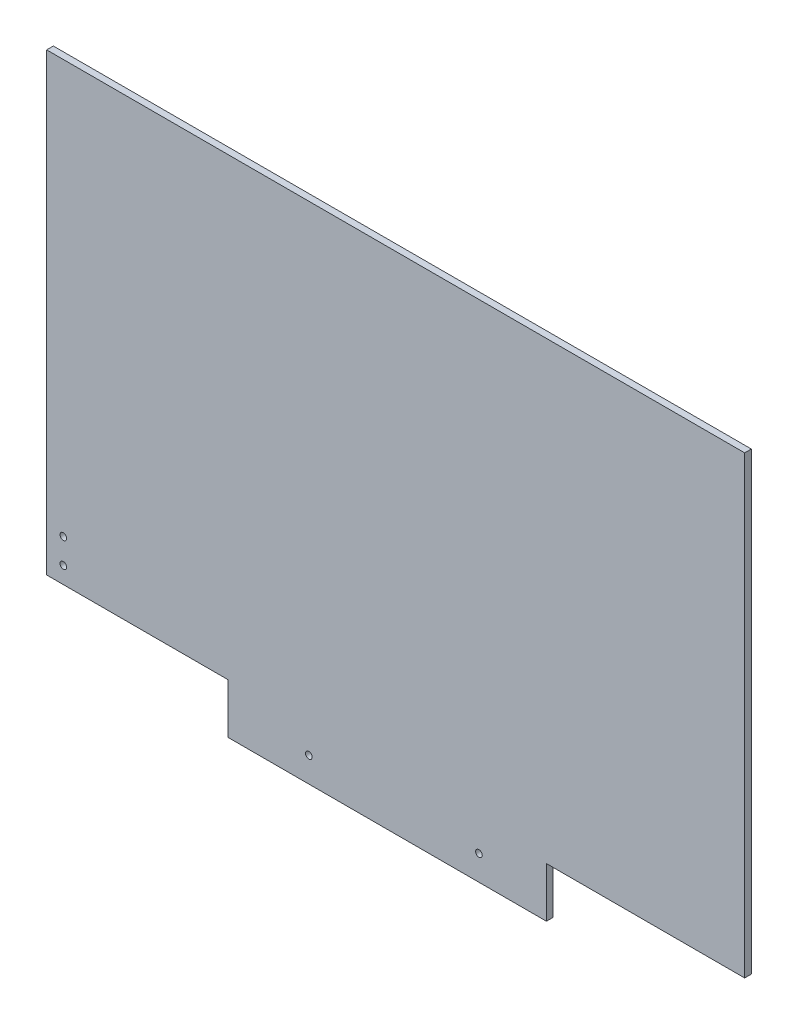
ISO-10303-21;
HEADER;
FILE_DESCRIPTION(('STEP AP214'),'2;1');
FILE_NAME('part.step','',(''),(''),'','','');
FILE_SCHEMA(('AUTOMOTIVE_DESIGN { 1 0 10303 214 1 1 1 1 }'));
ENDSEC;
DATA;
#1=APPLICATION_CONTEXT('core data for automotive mechanical design processes');
#2=APPLICATION_PROTOCOL_DEFINITION('international standard','automotive_design',2000,#1);
#3=PRODUCT_CONTEXT('',#1,'mechanical');
#4=PRODUCT('Part','Part','',(#3));
#5=PRODUCT_RELATED_PRODUCT_CATEGORY('part','',(#4));
#6=PRODUCT_DEFINITION_FORMATION('','',#4);
#7=PRODUCT_DEFINITION_CONTEXT('part definition',#1,'design');
#8=PRODUCT_DEFINITION('design','',#6,#7);
#9=PRODUCT_DEFINITION_SHAPE('','',#8);
#10=(LENGTH_UNIT() NAMED_UNIT(*) SI_UNIT(.MILLI.,.METRE.));
#11=(NAMED_UNIT(*) PLANE_ANGLE_UNIT() SI_UNIT($,.RADIAN.));
#12=(NAMED_UNIT(*) SI_UNIT($,.STERADIAN.) SOLID_ANGLE_UNIT());
#13=UNCERTAINTY_MEASURE_WITH_UNIT(LENGTH_MEASURE(1.E-05),#10,'distance_accuracy_value','');
#14=(GEOMETRIC_REPRESENTATION_CONTEXT(3) GLOBAL_UNCERTAINTY_ASSIGNED_CONTEXT((#13)) GLOBAL_UNIT_ASSIGNED_CONTEXT((#10,
#11,#12)) REPRESENTATION_CONTEXT('',''));
#15=CARTESIAN_POINT('',(0.,0.,0.));
#16=DIRECTION('',(0.,0.,1.));
#17=DIRECTION('',(1.,0.,0.));
#18=AXIS2_PLACEMENT_3D('',#15,#16,#17);
#19=CARTESIAN_POINT('',(209.5,151.5,4.));
#20=DIRECTION('',(-1.,0.,0.));
#21=DIRECTION('',(0.,-1.,0.));
#22=AXIS2_PLACEMENT_3D('',#19,#20,#21);
#23=PLANE('',#22);
#24=DIRECTION('',(0.,1.,0.));
#25=VECTOR('',#24,1.);
#26=CARTESIAN_POINT('',(209.5,151.5,4.));
#27=LINE('',#26,#25);
#28=CARTESIAN_POINT('',(209.5,-121.5,4.));
#29=VERTEX_POINT('',#28);
#30=CARTESIAN_POINT('',(209.5,151.5,4.));
#31=VERTEX_POINT('',#30);
#32=EDGE_CURVE('E138',#29,#31,#27,.T.);
#33=ORIENTED_EDGE('',*,*,#32,.F.);
#34=DIRECTION('',(0.,0.,-1.));
#35=VECTOR('',#34,1.);
#36=CARTESIAN_POINT('',(209.5,-121.5,4.));
#37=LINE('',#36,#35);
#38=CARTESIAN_POINT('',(209.5,-121.5,0.));
#39=VERTEX_POINT('',#38);
#40=EDGE_CURVE('E133',#29,#39,#37,.T.);
#41=ORIENTED_EDGE('',*,*,#40,.T.);
#42=DIRECTION('',(0.,1.,0.));
#43=VECTOR('',#42,1.);
#44=CARTESIAN_POINT('',(209.5,151.5,0.));
#45=LINE('',#44,#43);
#46=CARTESIAN_POINT('',(209.5,151.5,0.));
#47=VERTEX_POINT('',#46);
#48=EDGE_CURVE('E130',#39,#47,#45,.T.);
#49=ORIENTED_EDGE('',*,*,#48,.T.);
#50=DIRECTION('',(0.,0.,-1.));
#51=VECTOR('',#50,1.);
#52=CARTESIAN_POINT('',(209.5,151.5,4.));
#53=LINE('',#52,#51);
#54=EDGE_CURVE('E11',#31,#47,#53,.T.);
#55=ORIENTED_EDGE('',*,*,#54,.F.);
#56=EDGE_LOOP('',(#33,#41,#49,#55));
#57=FACE_BOUND('',#56,.T.);
#58=ADVANCED_FACE('F34',(#57),#23,.F.);
#59=CARTESIAN_POINT('',(-209.5,151.5,4.));
#60=DIRECTION('',(0.,-1.,0.));
#61=DIRECTION('',(0.,0.,-1.));
#62=AXIS2_PLACEMENT_3D('',#59,#60,#61);
#63=PLANE('',#62);
#64=DIRECTION('',(-1.,0.,0.));
#65=VECTOR('',#64,1.);
#66=CARTESIAN_POINT('',(-209.5,151.5,0.));
#67=LINE('',#66,#65);
#68=CARTESIAN_POINT('',(-209.5,151.5,0.));
#69=VERTEX_POINT('',#68);
#70=EDGE_CURVE('E132',#47,#69,#67,.T.);
#71=ORIENTED_EDGE('',*,*,#70,.T.);
#72=DIRECTION('',(0.,0.,-1.));
#73=VECTOR('',#72,1.);
#74=CARTESIAN_POINT('',(-209.5,151.5,4.));
#75=LINE('',#74,#73);
#76=CARTESIAN_POINT('',(-209.5,151.5,4.));
#77=VERTEX_POINT('',#76);
#78=EDGE_CURVE('E41',#77,#69,#75,.T.);
#79=ORIENTED_EDGE('',*,*,#78,.F.);
#80=DIRECTION('',(-1.,0.,0.));
#81=VECTOR('',#80,1.);
#82=CARTESIAN_POINT('',(-209.5,151.5,4.));
#83=LINE('',#82,#81);
#84=EDGE_CURVE('E126',#31,#77,#83,.T.);
#85=ORIENTED_EDGE('',*,*,#84,.F.);
#86=ORIENTED_EDGE('',*,*,#54,.T.);
#87=EDGE_LOOP('',(#71,#79,#85,#86));
#88=FACE_BOUND('',#87,.T.);
#89=ADVANCED_FACE('F228',(#88),#63,.F.);
#90=CARTESIAN_POINT('',(-209.5,151.5,4.));
#91=DIRECTION('',(1.,0.,0.));
#92=DIRECTION('',(0.,1.,0.));
#93=AXIS2_PLACEMENT_3D('',#90,#91,#92);
#94=PLANE('',#93);
#95=DIRECTION('',(0.,-1.,0.));
#96=VECTOR('',#95,1.);
#97=CARTESIAN_POINT('',(-209.5,151.5,0.));
#98=LINE('',#97,#96);
#99=CARTESIAN_POINT('',(-209.5,-121.5,0.));
#100=VERTEX_POINT('',#99);
#101=EDGE_CURVE('E135',#69,#100,#98,.T.);
#102=ORIENTED_EDGE('',*,*,#101,.T.);
#103=DIRECTION('',(0.,0.,-1.));
#104=VECTOR('',#103,1.);
#105=CARTESIAN_POINT('',(-209.5,-121.5,4.));
#106=LINE('',#105,#104);
#107=CARTESIAN_POINT('',(-209.5,-121.5,4.));
#108=VERTEX_POINT('',#107);
#109=EDGE_CURVE('E48',#108,#100,#106,.T.);
#110=ORIENTED_EDGE('',*,*,#109,.F.);
#111=DIRECTION('',(0.,-1.,0.));
#112=VECTOR('',#111,1.);
#113=CARTESIAN_POINT('',(-209.5,151.5,4.));
#114=LINE('',#113,#112);
#115=EDGE_CURVE('E122',#77,#108,#114,.T.);
#116=ORIENTED_EDGE('',*,*,#115,.F.);
#117=ORIENTED_EDGE('',*,*,#78,.T.);
#118=EDGE_LOOP('',(#102,#110,#116,#117));
#119=FACE_BOUND('',#118,.T.);
#120=ADVANCED_FACE('F232',(#119),#94,.F.);
#121=CARTESIAN_POINT('',(-209.5,-151.5,4.));
#122=DIRECTION('',(0.,1.,0.));
#123=DIRECTION('',(0.,0.,1.));
#124=AXIS2_PLACEMENT_3D('',#121,#122,#123);
#125=PLANE('',#124);
#126=DIRECTION('',(1.,0.,0.));
#127=VECTOR('',#126,1.);
#128=CARTESIAN_POINT('',(-209.5,-151.5,0.));
#129=LINE('',#128,#127);
#130=CARTESIAN_POINT('',(-100.5,-151.5,0.));
#131=VERTEX_POINT('',#130);
#132=CARTESIAN_POINT('',(90.5,-151.5,0.));
#133=VERTEX_POINT('',#132);
#134=EDGE_CURVE('E115',#131,#133,#129,.T.);
#135=ORIENTED_EDGE('',*,*,#134,.T.);
#136=DIRECTION('',(0.,0.,-1.));
#137=VECTOR('',#136,1.);
#138=CARTESIAN_POINT('',(90.5,-151.5,4.));
#139=LINE('',#138,#137);
#140=CARTESIAN_POINT('',(90.5,-151.5,4.));
#141=VERTEX_POINT('',#140);
#142=EDGE_CURVE('E56',#141,#133,#139,.T.);
#143=ORIENTED_EDGE('',*,*,#142,.F.);
#144=DIRECTION('',(1.,0.,0.));
#145=VECTOR('',#144,1.);
#146=CARTESIAN_POINT('',(-209.5,-151.5,4.));
#147=LINE('',#146,#145);
#148=CARTESIAN_POINT('',(-100.5,-151.5,4.));
#149=VERTEX_POINT('',#148);
#150=EDGE_CURVE('E113',#149,#141,#147,.T.);
#151=ORIENTED_EDGE('',*,*,#150,.F.);
#152=DIRECTION('',(0.,0.,-1.));
#153=VECTOR('',#152,1.);
#154=CARTESIAN_POINT('',(-100.5,-151.5,4.));
#155=LINE('',#154,#153);
#156=EDGE_CURVE('E146',#149,#131,#155,.T.);
#157=ORIENTED_EDGE('',*,*,#156,.T.);
#158=EDGE_LOOP('',(#135,#143,#151,#157));
#159=FACE_BOUND('',#158,.T.);
#160=ADVANCED_FACE('F111',(#159),#125,.F.);
#161=CARTESIAN_POINT('',(0.,0.,4.));
#162=DIRECTION('',(0.,0.,1.));
#163=DIRECTION('',(1.,0.,0.));
#164=AXIS2_PLACEMENT_3D('',#161,#162,#163);
#165=PLANE('',#164);
#166=CARTESIAN_POINT('',(-199.5,-111.5,4.));
#167=DIRECTION('',(0.,0.,-1.));
#168=DIRECTION('',(-1.,0.,0.));
#169=AXIS2_PLACEMENT_3D('',#166,#167,#168);
#170=CIRCLE('',#169,2.);
#171=CARTESIAN_POINT('',(-201.5,-111.5,4.));
#172=VERTEX_POINT('',#171);
#173=EDGE_CURVE('E167',#172,#172,#170,.T.);
#174=ORIENTED_EDGE('',*,*,#173,.T.);
#175=EDGE_LOOP('',(#174));
#176=FACE_BOUND('',#175,.T.);
#177=CARTESIAN_POINT('',(-199.5,-96.5,4.));
#178=DIRECTION('',(0.,0.,-1.));
#179=DIRECTION('',(-1.,0.,0.));
#180=AXIS2_PLACEMENT_3D('',#177,#178,#179);
#181=CIRCLE('',#180,2.);
#182=CARTESIAN_POINT('',(-201.5,-96.5,4.));
#183=VERTEX_POINT('',#182);
#184=EDGE_CURVE('E178',#183,#183,#181,.T.);
#185=ORIENTED_EDGE('',*,*,#184,.T.);
#186=EDGE_LOOP('',(#185));
#187=FACE_BOUND('',#186,.T.);
#188=CARTESIAN_POINT('',(49.9836025127862,-136.5,4.));
#189=DIRECTION('',(0.,0.,-1.));
#190=DIRECTION('',(-1.,0.,0.));
#191=AXIS2_PLACEMENT_3D('',#188,#189,#190);
#192=CIRCLE('',#191,2.);
#193=CARTESIAN_POINT('',(47.9836025127862,-136.5,4.));
#194=VERTEX_POINT('',#193);
#195=EDGE_CURVE('E154',#194,#194,#192,.T.);
#196=ORIENTED_EDGE('',*,*,#195,.T.);
#197=EDGE_LOOP('',(#196));
#198=FACE_BOUND('',#197,.T.);
#199=CARTESIAN_POINT('',(-52.1257569061911,-136.5,4.));
#200=DIRECTION('',(0.,0.,-1.));
#201=DIRECTION('',(-1.,0.,0.));
#202=AXIS2_PLACEMENT_3D('',#199,#200,#201);
#203=CIRCLE('',#202,2.);
#204=CARTESIAN_POINT('',(-54.1257569061911,-136.5,4.));
#205=VERTEX_POINT('',#204);
#206=EDGE_CURVE('E166',#205,#205,#203,.T.);
#207=ORIENTED_EDGE('',*,*,#206,.T.);
#208=EDGE_LOOP('',(#207));
#209=FACE_BOUND('',#208,.T.);
#210=DIRECTION('',(1.,0.,0.));
#211=VECTOR('',#210,1.);
#212=CARTESIAN_POINT('',(209.5,-121.5,4.));
#213=LINE('',#212,#211);
#214=CARTESIAN_POINT('',(90.5,-121.5,4.));
#215=VERTEX_POINT('',#214);
#216=EDGE_CURVE('E105',#215,#29,#213,.T.);
#217=ORIENTED_EDGE('',*,*,#216,.T.);
#218=ORIENTED_EDGE('',*,*,#32,.T.);
#219=ORIENTED_EDGE('',*,*,#84,.T.);
#220=ORIENTED_EDGE('',*,*,#115,.T.);
#221=DIRECTION('',(1.,0.,0.));
#222=VECTOR('',#221,1.);
#223=CARTESIAN_POINT('',(-209.5,-121.5,4.));
#224=LINE('',#223,#222);
#225=CARTESIAN_POINT('',(-100.5,-121.5,4.));
#226=VERTEX_POINT('',#225);
#227=EDGE_CURVE('E151',#108,#226,#224,.T.);
#228=ORIENTED_EDGE('',*,*,#227,.T.);
#229=DIRECTION('',(0.,-1.,0.));
#230=VECTOR('',#229,1.);
#231=CARTESIAN_POINT('',(-100.5,-121.5,4.));
#232=LINE('',#231,#230);
#233=EDGE_CURVE('E121',#226,#149,#232,.T.);
#234=ORIENTED_EDGE('',*,*,#233,.T.);
#235=ORIENTED_EDGE('',*,*,#150,.T.);
#236=DIRECTION('',(0.,1.,0.));
#237=VECTOR('',#236,1.);
#238=CARTESIAN_POINT('',(90.5,-121.5,4.));
#239=LINE('',#238,#237);
#240=EDGE_CURVE('E98',#141,#215,#239,.T.);
#241=ORIENTED_EDGE('',*,*,#240,.T.);
#242=EDGE_LOOP('',(#217,#218,#219,#220,#228,#234,#235,#241));
#243=FACE_BOUND('',#242,.T.);
#244=ADVANCED_FACE('F118',(#176,#187,#198,#209,#243),#165,.T.);
#245=CARTESIAN_POINT('',(0.,0.,0.));
#246=DIRECTION('',(0.,0.,1.));
#247=DIRECTION('',(1.,0.,0.));
#248=AXIS2_PLACEMENT_3D('',#245,#246,#247);
#249=PLANE('',#248);
#250=CARTESIAN_POINT('',(-199.5,-111.5,0.));
#251=DIRECTION('',(0.,0.,-1.));
#252=DIRECTION('',(-1.,0.,0.));
#253=AXIS2_PLACEMENT_3D('',#250,#251,#252);
#254=CIRCLE('',#253,2.);
#255=CARTESIAN_POINT('',(-201.5,-111.5,0.));
#256=VERTEX_POINT('',#255);
#257=EDGE_CURVE('E181',#256,#256,#254,.T.);
#258=ORIENTED_EDGE('',*,*,#257,.F.);
#259=EDGE_LOOP('',(#258));
#260=FACE_BOUND('',#259,.T.);
#261=CARTESIAN_POINT('',(-199.5,-96.5,0.));
#262=DIRECTION('',(0.,0.,-1.));
#263=DIRECTION('',(-1.,0.,0.));
#264=AXIS2_PLACEMENT_3D('',#261,#262,#263);
#265=CIRCLE('',#264,2.);
#266=CARTESIAN_POINT('',(-201.5,-96.5,0.));
#267=VERTEX_POINT('',#266);
#268=EDGE_CURVE('E175',#267,#267,#265,.T.);
#269=ORIENTED_EDGE('',*,*,#268,.F.);
#270=EDGE_LOOP('',(#269));
#271=FACE_BOUND('',#270,.T.);
#272=CARTESIAN_POINT('',(49.9836025127862,-136.5,0.));
#273=DIRECTION('',(0.,0.,-1.));
#274=DIRECTION('',(-1.,0.,0.));
#275=AXIS2_PLACEMENT_3D('',#272,#273,#274);
#276=CIRCLE('',#275,2.);
#277=CARTESIAN_POINT('',(47.9836025127862,-136.5,0.));
#278=VERTEX_POINT('',#277);
#279=EDGE_CURVE('E170',#278,#278,#276,.T.);
#280=ORIENTED_EDGE('',*,*,#279,.F.);
#281=EDGE_LOOP('',(#280));
#282=FACE_BOUND('',#281,.T.);
#283=CARTESIAN_POINT('',(-52.1257569061911,-136.5,0.));
#284=DIRECTION('',(0.,0.,-1.));
#285=DIRECTION('',(-1.,0.,0.));
#286=AXIS2_PLACEMENT_3D('',#283,#284,#285);
#287=CIRCLE('',#286,2.);
#288=CARTESIAN_POINT('',(-54.1257569061911,-136.5,0.));
#289=VERTEX_POINT('',#288);
#290=EDGE_CURVE('E163',#289,#289,#287,.T.);
#291=ORIENTED_EDGE('',*,*,#290,.F.);
#292=EDGE_LOOP('',(#291));
#293=FACE_BOUND('',#292,.T.);
#294=ORIENTED_EDGE('',*,*,#48,.F.);
#295=DIRECTION('',(1.,0.,0.));
#296=VECTOR('',#295,1.);
#297=CARTESIAN_POINT('',(209.5,-121.5,0.));
#298=LINE('',#297,#296);
#299=CARTESIAN_POINT('',(90.5,-121.5,0.));
#300=VERTEX_POINT('',#299);
#301=EDGE_CURVE('E106',#300,#39,#298,.T.);
#302=ORIENTED_EDGE('',*,*,#301,.F.);
#303=DIRECTION('',(0.,1.,0.));
#304=VECTOR('',#303,1.);
#305=CARTESIAN_POINT('',(90.5,-121.5,0.));
#306=LINE('',#305,#304);
#307=EDGE_CURVE('E148',#133,#300,#306,.T.);
#308=ORIENTED_EDGE('',*,*,#307,.F.);
#309=ORIENTED_EDGE('',*,*,#134,.F.);
#310=DIRECTION('',(0.,-1.,0.));
#311=VECTOR('',#310,1.);
#312=CARTESIAN_POINT('',(-100.5,-121.5,0.));
#313=LINE('',#312,#311);
#314=CARTESIAN_POINT('',(-100.5,-121.5,0.));
#315=VERTEX_POINT('',#314);
#316=EDGE_CURVE('E149',#315,#131,#313,.T.);
#317=ORIENTED_EDGE('',*,*,#316,.F.);
#318=DIRECTION('',(1.,0.,0.));
#319=VECTOR('',#318,1.);
#320=CARTESIAN_POINT('',(-209.5,-121.5,0.));
#321=LINE('',#320,#319);
#322=EDGE_CURVE('E152',#100,#315,#321,.T.);
#323=ORIENTED_EDGE('',*,*,#322,.F.);
#324=ORIENTED_EDGE('',*,*,#101,.F.);
#325=ORIENTED_EDGE('',*,*,#70,.F.);
#326=EDGE_LOOP('',(#294,#302,#308,#309,#317,#323,#324,#325));
#327=FACE_BOUND('',#326,.T.);
#328=ADVANCED_FACE('F196',(#260,#271,#282,#293,#327),#249,.F.);
#329=CARTESIAN_POINT('',(-100.5,-121.5,4.));
#330=DIRECTION('',(1.,0.,0.));
#331=DIRECTION('',(0.,0.,-1.));
#332=AXIS2_PLACEMENT_3D('',#329,#330,#331);
#333=PLANE('',#332);
#334=ORIENTED_EDGE('',*,*,#316,.T.);
#335=ORIENTED_EDGE('',*,*,#156,.F.);
#336=ORIENTED_EDGE('',*,*,#233,.F.);
#337=DIRECTION('',(0.,0.,-1.));
#338=VECTOR('',#337,1.);
#339=CARTESIAN_POINT('',(-100.5,-121.5,4.));
#340=LINE('',#339,#338);
#341=EDGE_CURVE('E144',#226,#315,#340,.T.);
#342=ORIENTED_EDGE('',*,*,#341,.T.);
#343=EDGE_LOOP('',(#334,#335,#336,#342));
#344=FACE_BOUND('',#343,.T.);
#345=ADVANCED_FACE('F199',(#344),#333,.F.);
#346=CARTESIAN_POINT('',(-209.5,-121.5,4.));
#347=DIRECTION('',(0.,1.,0.));
#348=DIRECTION('',(0.,0.,1.));
#349=AXIS2_PLACEMENT_3D('',#346,#347,#348);
#350=PLANE('',#349);
#351=ORIENTED_EDGE('',*,*,#322,.T.);
#352=ORIENTED_EDGE('',*,*,#341,.F.);
#353=ORIENTED_EDGE('',*,*,#227,.F.);
#354=ORIENTED_EDGE('',*,*,#109,.T.);
#355=EDGE_LOOP('',(#351,#352,#353,#354));
#356=FACE_BOUND('',#355,.T.);
#357=ADVANCED_FACE('F217',(#356),#350,.F.);
#358=CARTESIAN_POINT('',(209.5,-121.5,4.));
#359=DIRECTION('',(0.,1.,0.));
#360=DIRECTION('',(-1.,0.,0.));
#361=AXIS2_PLACEMENT_3D('',#358,#359,#360);
#362=PLANE('',#361);
#363=ORIENTED_EDGE('',*,*,#301,.T.);
#364=ORIENTED_EDGE('',*,*,#40,.F.);
#365=ORIENTED_EDGE('',*,*,#216,.F.);
#366=DIRECTION('',(0.,0.,-1.));
#367=VECTOR('',#366,1.);
#368=CARTESIAN_POINT('',(90.5,-121.5,4.));
#369=LINE('',#368,#367);
#370=EDGE_CURVE('E100',#215,#300,#369,.T.);
#371=ORIENTED_EDGE('',*,*,#370,.T.);
#372=EDGE_LOOP('',(#363,#364,#365,#371));
#373=FACE_BOUND('',#372,.T.);
#374=ADVANCED_FACE('F214',(#373),#362,.F.);
#375=CARTESIAN_POINT('',(90.5,-121.5,4.));
#376=DIRECTION('',(-1.,0.,0.));
#377=DIRECTION('',(0.,-1.,0.));
#378=AXIS2_PLACEMENT_3D('',#375,#376,#377);
#379=PLANE('',#378);
#380=ORIENTED_EDGE('',*,*,#307,.T.);
#381=ORIENTED_EDGE('',*,*,#370,.F.);
#382=ORIENTED_EDGE('',*,*,#240,.F.);
#383=ORIENTED_EDGE('',*,*,#142,.T.);
#384=EDGE_LOOP('',(#380,#381,#382,#383));
#385=FACE_BOUND('',#384,.T.);
#386=ADVANCED_FACE('F99',(#385),#379,.F.);
#387=CARTESIAN_POINT('',(-52.1257569061911,-136.5,4.));
#388=DIRECTION('',(0.,0.,-1.));
#389=DIRECTION('',(-1.,0.,0.));
#390=AXIS2_PLACEMENT_3D('',#387,#388,#389);
#391=CYLINDRICAL_SURFACE('',#390,2.);
#392=ORIENTED_EDGE('',*,*,#206,.F.);
#393=EDGE_LOOP('',(#392));
#394=FACE_BOUND('',#393,.T.);
#395=ORIENTED_EDGE('',*,*,#290,.T.);
#396=EDGE_LOOP('',(#395));
#397=FACE_BOUND('',#396,.T.);
#398=ADVANCED_FACE('F278',(#394,#397),#391,.F.);
#399=CARTESIAN_POINT('',(49.9836025127862,-136.5,4.));
#400=DIRECTION('',(0.,0.,-1.));
#401=DIRECTION('',(-1.,0.,0.));
#402=AXIS2_PLACEMENT_3D('',#399,#400,#401);
#403=CYLINDRICAL_SURFACE('',#402,2.);
#404=ORIENTED_EDGE('',*,*,#195,.F.);
#405=EDGE_LOOP('',(#404));
#406=FACE_BOUND('',#405,.T.);
#407=ORIENTED_EDGE('',*,*,#279,.T.);
#408=EDGE_LOOP('',(#407));
#409=FACE_BOUND('',#408,.T.);
#410=ADVANCED_FACE('F286',(#406,#409),#403,.F.);
#411=CARTESIAN_POINT('',(-199.5,-96.5,4.));
#412=DIRECTION('',(0.,0.,-1.));
#413=DIRECTION('',(-1.,0.,0.));
#414=AXIS2_PLACEMENT_3D('',#411,#412,#413);
#415=CYLINDRICAL_SURFACE('',#414,2.);
#416=ORIENTED_EDGE('',*,*,#184,.F.);
#417=EDGE_LOOP('',(#416));
#418=FACE_BOUND('',#417,.T.);
#419=ORIENTED_EDGE('',*,*,#268,.T.);
#420=EDGE_LOOP('',(#419));
#421=FACE_BOUND('',#420,.T.);
#422=ADVANCED_FACE('F192',(#418,#421),#415,.F.);
#423=CARTESIAN_POINT('',(-199.5,-111.5,4.));
#424=DIRECTION('',(0.,0.,-1.));
#425=DIRECTION('',(-1.,0.,0.));
#426=AXIS2_PLACEMENT_3D('',#423,#424,#425);
#427=CYLINDRICAL_SURFACE('',#426,2.);
#428=ORIENTED_EDGE('',*,*,#173,.F.);
#429=EDGE_LOOP('',(#428));
#430=FACE_BOUND('',#429,.T.);
#431=ORIENTED_EDGE('',*,*,#257,.T.);
#432=EDGE_LOOP('',(#431));
#433=FACE_BOUND('',#432,.T.);
#434=ADVANCED_FACE('F189',(#430,#433),#427,.F.);
#435=CLOSED_SHELL('',(#58,#89,#120,#160,#244,#328,#345,#357,#374,#386,#398,#410,#422,#434));
#436=MANIFOLD_SOLID_BREP('B2',#435);
#437=ADVANCED_BREP_SHAPE_REPRESENTATION('',(#18,#436),#14);
#438=SHAPE_DEFINITION_REPRESENTATION(#9,#437);
ENDSEC;
END-ISO-10303-21;
